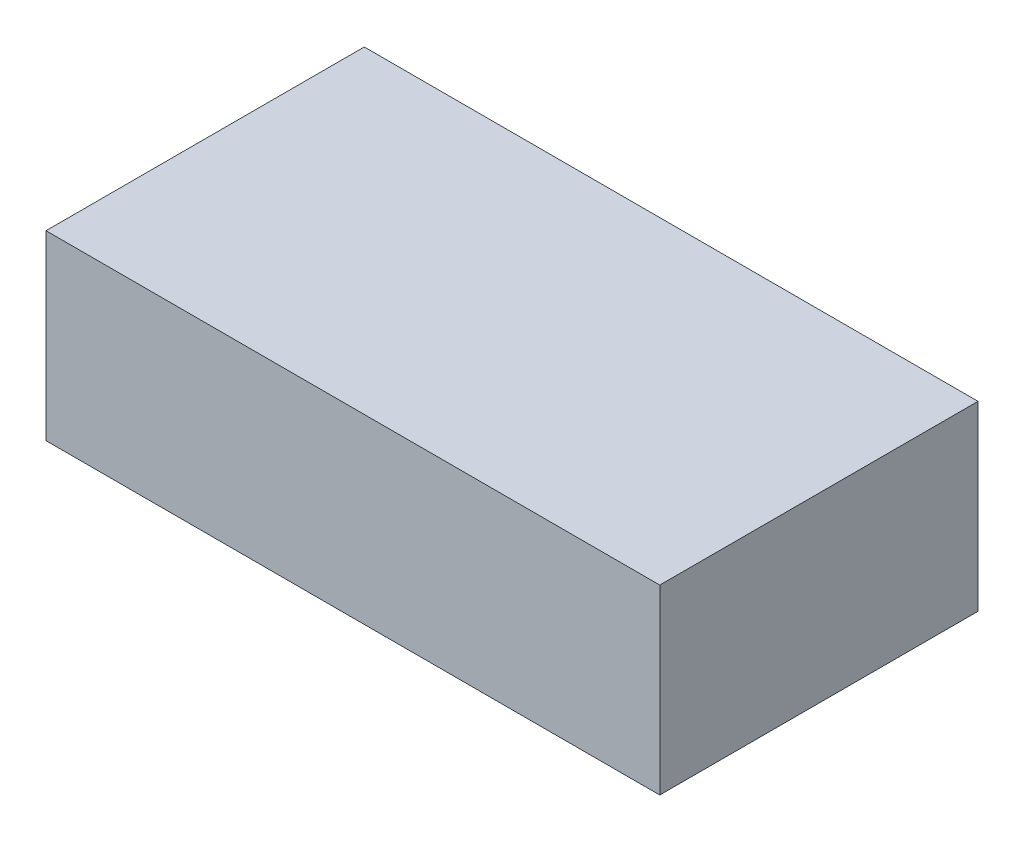
ISO-10303-21;
HEADER;
FILE_DESCRIPTION(('STEP AP214'),'2;1');
FILE_NAME('part.step','',(''),(''),'','','');
FILE_SCHEMA(('AUTOMOTIVE_DESIGN { 1 0 10303 214 1 1 1 1 }'));
ENDSEC;
DATA;
#1=APPLICATION_CONTEXT('core data for automotive mechanical design processes');
#2=APPLICATION_PROTOCOL_DEFINITION('international standard','automotive_design',2000,#1);
#3=PRODUCT_CONTEXT('',#1,'mechanical');
#4=PRODUCT('Part','Part','',(#3));
#5=PRODUCT_RELATED_PRODUCT_CATEGORY('part','',(#4));
#6=PRODUCT_DEFINITION_FORMATION('','',#4);
#7=PRODUCT_DEFINITION_CONTEXT('part definition',#1,'design');
#8=PRODUCT_DEFINITION('design','',#6,#7);
#9=PRODUCT_DEFINITION_SHAPE('','',#8);
#10=(LENGTH_UNIT() NAMED_UNIT(*) SI_UNIT(.MILLI.,.METRE.));
#11=(NAMED_UNIT(*) PLANE_ANGLE_UNIT() SI_UNIT($,.RADIAN.));
#12=(NAMED_UNIT(*) SI_UNIT($,.STERADIAN.) SOLID_ANGLE_UNIT());
#13=UNCERTAINTY_MEASURE_WITH_UNIT(LENGTH_MEASURE(1.E-05),#10,'distance_accuracy_value','');
#14=(GEOMETRIC_REPRESENTATION_CONTEXT(3) GLOBAL_UNCERTAINTY_ASSIGNED_CONTEXT((#13)) GLOBAL_UNIT_ASSIGNED_CONTEXT((#10,
#11,#12)) REPRESENTATION_CONTEXT('',''));
#15=CARTESIAN_POINT('',(0.,0.,0.));
#16=DIRECTION('',(0.,0.,1.));
#17=DIRECTION('',(1.,0.,0.));
#18=AXIS2_PLACEMENT_3D('',#15,#16,#17);
#19=CARTESIAN_POINT('',(0.,48.,0.));
#20=DIRECTION('',(1.,0.,0.));
#21=DIRECTION('',(0.,0.,-1.));
#22=AXIS2_PLACEMENT_3D('',#19,#20,#21);
#23=PLANE('',#22);
#24=DIRECTION('',(0.,0.,1.));
#25=VECTOR('',#24,1.);
#26=CARTESIAN_POINT('',(0.,0.,0.));
#27=LINE('',#26,#25);
#28=CARTESIAN_POINT('',(0.,0.,-84.));
#29=VERTEX_POINT('',#28);
#30=CARTESIAN_POINT('',(0.,0.,0.));
#31=VERTEX_POINT('',#30);
#32=EDGE_CURVE('E97',#29,#31,#27,.T.);
#33=ORIENTED_EDGE('',*,*,#32,.T.);
#34=DIRECTION('',(0.,-1.,0.));
#35=VECTOR('',#34,1.);
#36=CARTESIAN_POINT('',(0.,48.,0.));
#37=LINE('',#36,#35);
#38=CARTESIAN_POINT('',(0.,48.,0.));
#39=VERTEX_POINT('',#38);
#40=EDGE_CURVE('E11',#39,#31,#37,.T.);
#41=ORIENTED_EDGE('',*,*,#40,.F.);
#42=DIRECTION('',(0.,0.,1.));
#43=VECTOR('',#42,1.);
#44=CARTESIAN_POINT('',(0.,48.,0.));
#45=LINE('',#44,#43);
#46=CARTESIAN_POINT('',(0.,48.,-84.));
#47=VERTEX_POINT('',#46);
#48=EDGE_CURVE('E85',#47,#39,#45,.T.);
#49=ORIENTED_EDGE('',*,*,#48,.F.);
#50=DIRECTION('',(0.,-1.,0.));
#51=VECTOR('',#50,1.);
#52=CARTESIAN_POINT('',(0.,48.,-84.));
#53=LINE('',#52,#51);
#54=EDGE_CURVE('E93',#47,#29,#53,.T.);
#55=ORIENTED_EDGE('',*,*,#54,.T.);
#56=EDGE_LOOP('',(#33,#41,#49,#55));
#57=FACE_BOUND('',#56,.T.);
#58=ADVANCED_FACE('F34',(#57),#23,.F.);
#59=CARTESIAN_POINT('',(0.,48.,0.));
#60=DIRECTION('',(0.,0.,-1.));
#61=DIRECTION('',(-1.,0.,0.));
#62=AXIS2_PLACEMENT_3D('',#59,#60,#61);
#63=PLANE('',#62);
#64=DIRECTION('',(1.,0.,0.));
#65=VECTOR('',#64,1.);
#66=CARTESIAN_POINT('',(0.,0.,0.));
#67=LINE('',#66,#65);
#68=CARTESIAN_POINT('',(162.,0.,0.));
#69=VERTEX_POINT('',#68);
#70=EDGE_CURVE('E89',#31,#69,#67,.T.);
#71=ORIENTED_EDGE('',*,*,#70,.T.);
#72=DIRECTION('',(0.,-1.,0.));
#73=VECTOR('',#72,1.);
#74=CARTESIAN_POINT('',(162.,48.,0.));
#75=LINE('',#74,#73);
#76=CARTESIAN_POINT('',(162.,48.,0.));
#77=VERTEX_POINT('',#76);
#78=EDGE_CURVE('E42',#77,#69,#75,.T.);
#79=ORIENTED_EDGE('',*,*,#78,.F.);
#80=DIRECTION('',(1.,0.,0.));
#81=VECTOR('',#80,1.);
#82=CARTESIAN_POINT('',(0.,48.,0.));
#83=LINE('',#82,#81);
#84=EDGE_CURVE('E80',#39,#77,#83,.T.);
#85=ORIENTED_EDGE('',*,*,#84,.F.);
#86=ORIENTED_EDGE('',*,*,#40,.T.);
#87=EDGE_LOOP('',(#71,#79,#85,#86));
#88=FACE_BOUND('',#87,.T.);
#89=ADVANCED_FACE('F88',(#88),#63,.F.);
#90=CARTESIAN_POINT('',(162.,48.,0.));
#91=DIRECTION('',(-1.,0.,0.));
#92=DIRECTION('',(0.,0.,1.));
#93=AXIS2_PLACEMENT_3D('',#90,#91,#92);
#94=PLANE('',#93);
#95=DIRECTION('',(0.,0.,-1.));
#96=VECTOR('',#95,1.);
#97=CARTESIAN_POINT('',(162.,0.,0.));
#98=LINE('',#97,#96);
#99=CARTESIAN_POINT('',(162.,0.,-84.));
#100=VERTEX_POINT('',#99);
#101=EDGE_CURVE('E67',#69,#100,#98,.T.);
#102=ORIENTED_EDGE('',*,*,#101,.T.);
#103=DIRECTION('',(0.,-1.,0.));
#104=VECTOR('',#103,1.);
#105=CARTESIAN_POINT('',(162.,48.,-84.));
#106=LINE('',#105,#104);
#107=CARTESIAN_POINT('',(162.,48.,-84.));
#108=VERTEX_POINT('',#107);
#109=EDGE_CURVE('E90',#108,#100,#106,.T.);
#110=ORIENTED_EDGE('',*,*,#109,.F.);
#111=DIRECTION('',(0.,0.,-1.));
#112=VECTOR('',#111,1.);
#113=CARTESIAN_POINT('',(162.,48.,0.));
#114=LINE('',#113,#112);
#115=EDGE_CURVE('E83',#77,#108,#114,.T.);
#116=ORIENTED_EDGE('',*,*,#115,.F.);
#117=ORIENTED_EDGE('',*,*,#78,.T.);
#118=EDGE_LOOP('',(#102,#110,#116,#117));
#119=FACE_BOUND('',#118,.T.);
#120=ADVANCED_FACE('F91',(#119),#94,.F.);
#121=CARTESIAN_POINT('',(0.,48.,-84.));
#122=DIRECTION('',(0.,0.,1.));
#123=DIRECTION('',(1.,0.,0.));
#124=AXIS2_PLACEMENT_3D('',#121,#122,#123);
#125=PLANE('',#124);
#126=DIRECTION('',(-1.,0.,0.));
#127=VECTOR('',#126,1.);
#128=CARTESIAN_POINT('',(0.,0.,-84.));
#129=LINE('',#128,#127);
#130=EDGE_CURVE('E73',#100,#29,#129,.T.);
#131=ORIENTED_EDGE('',*,*,#130,.T.);
#132=ORIENTED_EDGE('',*,*,#54,.F.);
#133=DIRECTION('',(-1.,0.,0.));
#134=VECTOR('',#133,1.);
#135=CARTESIAN_POINT('',(0.,48.,-84.));
#136=LINE('',#135,#134);
#137=EDGE_CURVE('E50',#108,#47,#136,.T.);
#138=ORIENTED_EDGE('',*,*,#137,.F.);
#139=ORIENTED_EDGE('',*,*,#109,.T.);
#140=EDGE_LOOP('',(#131,#132,#138,#139));
#141=FACE_BOUND('',#140,.T.);
#142=ADVANCED_FACE('F104',(#141),#125,.F.);
#143=CARTESIAN_POINT('',(0.,48.,0.));
#144=DIRECTION('',(0.,-1.,0.));
#145=DIRECTION('',(0.,0.,-1.));
#146=AXIS2_PLACEMENT_3D('',#143,#144,#145);
#147=PLANE('',#146);
#148=ORIENTED_EDGE('',*,*,#48,.T.);
#149=ORIENTED_EDGE('',*,*,#84,.T.);
#150=ORIENTED_EDGE('',*,*,#115,.T.);
#151=ORIENTED_EDGE('',*,*,#137,.T.);
#152=EDGE_LOOP('',(#148,#149,#150,#151));
#153=FACE_BOUND('',#152,.T.);
#154=ADVANCED_FACE('F81',(#153),#147,.F.);
#155=CARTESIAN_POINT('',(0.,0.,0.));
#156=DIRECTION('',(0.,-1.,0.));
#157=DIRECTION('',(0.,0.,-1.));
#158=AXIS2_PLACEMENT_3D('',#155,#156,#157);
#159=PLANE('',#158);
#160=ORIENTED_EDGE('',*,*,#32,.F.);
#161=ORIENTED_EDGE('',*,*,#130,.F.);
#162=ORIENTED_EDGE('',*,*,#101,.F.);
#163=ORIENTED_EDGE('',*,*,#70,.F.);
#164=EDGE_LOOP('',(#160,#161,#162,#163));
#165=FACE_BOUND('',#164,.T.);
#166=ADVANCED_FACE('F107',(#165),#159,.T.);
#167=CLOSED_SHELL('',(#58,#89,#120,#142,#154,#166));
#168=MANIFOLD_SOLID_BREP('B2',#167);
#169=ADVANCED_BREP_SHAPE_REPRESENTATION('',(#18,#168),#14);
#170=SHAPE_DEFINITION_REPRESENTATION(#9,#169);
ENDSEC;
END-ISO-10303-21;
